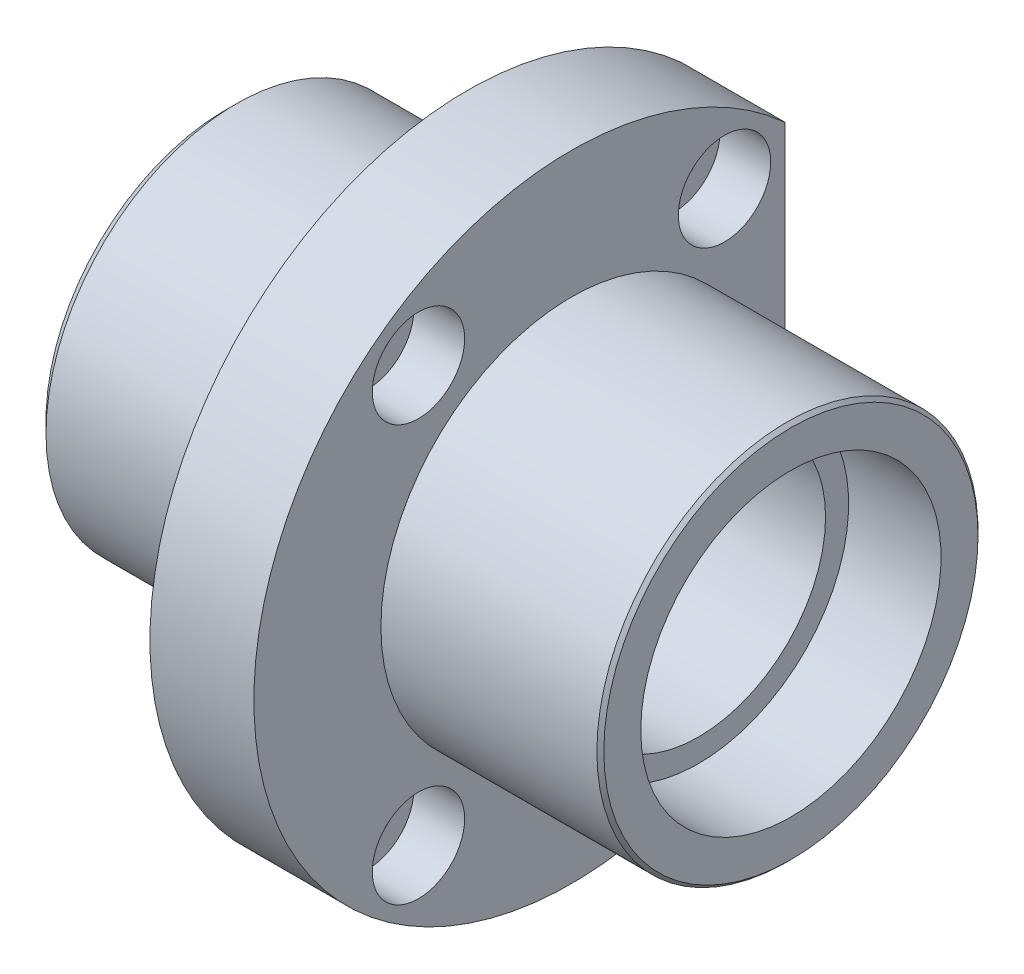
ISO-10303-21;
HEADER;
FILE_DESCRIPTION(('STEP AP214'),'2;1');
FILE_NAME('part.step','',(''),(''),'','','');
FILE_SCHEMA(('AUTOMOTIVE_DESIGN { 1 0 10303 214 1 1 1 1 }'));
ENDSEC;
DATA;
#1=APPLICATION_CONTEXT('core data for automotive mechanical design processes');
#2=APPLICATION_PROTOCOL_DEFINITION('international standard','automotive_design',2000,#1);
#3=PRODUCT_CONTEXT('',#1,'mechanical');
#4=PRODUCT('Part','Part','',(#3));
#5=PRODUCT_RELATED_PRODUCT_CATEGORY('part','',(#4));
#6=PRODUCT_DEFINITION_FORMATION('','',#4);
#7=PRODUCT_DEFINITION_CONTEXT('part definition',#1,'design');
#8=PRODUCT_DEFINITION('design','',#6,#7);
#9=PRODUCT_DEFINITION_SHAPE('','',#8);
#10=(LENGTH_UNIT() NAMED_UNIT(*) SI_UNIT(.MILLI.,.METRE.));
#11=(NAMED_UNIT(*) PLANE_ANGLE_UNIT() SI_UNIT($,.RADIAN.));
#12=(NAMED_UNIT(*) SI_UNIT($,.STERADIAN.) SOLID_ANGLE_UNIT());
#13=UNCERTAINTY_MEASURE_WITH_UNIT(LENGTH_MEASURE(1.E-05),#10,'distance_accuracy_value','');
#14=(GEOMETRIC_REPRESENTATION_CONTEXT(3) GLOBAL_UNCERTAINTY_ASSIGNED_CONTEXT((#13)) GLOBAL_UNIT_ASSIGNED_CONTEXT((#10,
#11,#12)) REPRESENTATION_CONTEXT('',''));
#15=CARTESIAN_POINT('',(0.,0.,0.));
#16=DIRECTION('',(0.,0.,1.));
#17=DIRECTION('',(1.,0.,0.));
#18=AXIS2_PLACEMENT_3D('',#15,#16,#17);
#19=CARTESIAN_POINT('',(-21.,0.,0.));
#20=DIRECTION('',(1.,0.,0.));
#21=DIRECTION('',(0.,0.,-1.));
#22=AXIS2_PLACEMENT_3D('',#19,#20,#21);
#23=PLANE('',#22);
#24=CARTESIAN_POINT('',(-21.,0.,0.));
#25=DIRECTION('',(1.,0.,0.));
#26=DIRECTION('',(0.,0.,-1.));
#27=AXIS2_PLACEMENT_3D('',#24,#25,#26);
#28=CIRCLE('',#27,15.5);
#29=CARTESIAN_POINT('',(-21.,0.,-15.5));
#30=VERTEX_POINT('',#29);
#31=EDGE_CURVE('E76',#30,#30,#28,.F.);
#32=ORIENTED_EDGE('',*,*,#31,.T.);
#33=EDGE_LOOP('',(#32));
#34=FACE_BOUND('',#33,.T.);
#35=CARTESIAN_POINT('',(-21.,0.,0.));
#36=DIRECTION('',(-1.,0.,0.));
#37=DIRECTION('',(0.,0.,1.));
#38=AXIS2_PLACEMENT_3D('',#35,#36,#37);
#39=CIRCLE('',#38,13.);
#40=CARTESIAN_POINT('',(-21.,0.,13.));
#41=VERTEX_POINT('',#40);
#42=EDGE_CURVE('E265',#41,#41,#39,.T.);
#43=ORIENTED_EDGE('',*,*,#42,.F.);
#44=EDGE_LOOP('',(#43));
#45=FACE_BOUND('',#44,.T.);
#46=ADVANCED_FACE('F32',(#34,#45),#23,.F.);
#47=CARTESIAN_POINT('',(28.,16.5,0.));
#48=DIRECTION('',(-1.,0.,0.));
#49=DIRECTION('',(0.,0.,1.));
#50=AXIS2_PLACEMENT_3D('',#47,#48,#49);
#51=PLANE('',#50);
#52=CARTESIAN_POINT('',(28.,0.,0.));
#53=DIRECTION('',(-1.,0.,0.));
#54=DIRECTION('',(0.,0.,1.));
#55=AXIS2_PLACEMENT_3D('',#52,#53,#54);
#56=CIRCLE('',#55,16.2);
#57=CARTESIAN_POINT('',(28.,0.,16.2));
#58=VERTEX_POINT('',#57);
#59=EDGE_CURVE('E11',#58,#58,#56,.F.);
#60=ORIENTED_EDGE('',*,*,#59,.T.);
#61=EDGE_LOOP('',(#60));
#62=FACE_BOUND('',#61,.T.);
#63=CARTESIAN_POINT('',(28.,0.,0.));
#64=DIRECTION('',(-1.,0.,0.));
#65=DIRECTION('',(0.,0.,1.));
#66=AXIS2_PLACEMENT_3D('',#63,#64,#65);
#67=CIRCLE('',#66,13.);
#68=CARTESIAN_POINT('',(28.,0.,13.));
#69=VERTEX_POINT('',#68);
#70=EDGE_CURVE('E62',#69,#69,#67,.T.);
#71=ORIENTED_EDGE('',*,*,#70,.T.);
#72=EDGE_LOOP('',(#71));
#73=FACE_BOUND('',#72,.T.);
#74=ADVANCED_FACE('F121',(#62,#73),#51,.F.);
#75=CARTESIAN_POINT('',(-30.2027653872065,0.,0.));
#76=DIRECTION('',(-1.,0.,0.));
#77=DIRECTION('',(0.,0.,1.));
#78=AXIS2_PLACEMENT_3D('',#75,#76,#77);
#79=CYLINDRICAL_SURFACE('',#78,16.5);
#80=CARTESIAN_POINT('',(-20.,0.,0.));
#81=DIRECTION('',(1.,0.,0.));
#82=DIRECTION('',(0.,0.,-1.));
#83=AXIS2_PLACEMENT_3D('',#80,#81,#82);
#84=CIRCLE('',#83,16.5);
#85=CARTESIAN_POINT('',(-20.,0.,-16.5));
#86=VERTEX_POINT('',#85);
#87=EDGE_CURVE('E103',#86,#86,#84,.T.);
#88=ORIENTED_EDGE('',*,*,#87,.T.);
#89=EDGE_LOOP('',(#88));
#90=FACE_BOUND('',#89,.T.);
#91=CARTESIAN_POINT('',(0.,0.,0.));
#92=DIRECTION('',(-1.,0.,0.));
#93=DIRECTION('',(0.,0.,1.));
#94=AXIS2_PLACEMENT_3D('',#91,#92,#93);
#95=CIRCLE('',#94,16.5);
#96=CARTESIAN_POINT('',(0.,0.,16.5));
#97=VERTEX_POINT('',#96);
#98=EDGE_CURVE('E73',#97,#97,#95,.T.);
#99=ORIENTED_EDGE('',*,*,#98,.T.);
#100=EDGE_LOOP('',(#99));
#101=FACE_BOUND('',#100,.T.);
#102=ADVANCED_FACE('F127',(#90,#101),#79,.T.);
#103=CARTESIAN_POINT('',(0.,16.5,0.));
#104=DIRECTION('',(1.,0.,0.));
#105=DIRECTION('',(0.,0.,-1.));
#106=AXIS2_PLACEMENT_3D('',#103,#104,#105);
#107=PLANE('',#106);
#108=CARTESIAN_POINT('',(0.,18.,13.25));
#109=DIRECTION('',(1.,0.,0.));
#110=DIRECTION('',(0.,0.,-1.));
#111=AXIS2_PLACEMENT_3D('',#108,#109,#110);
#112=CIRCLE('',#111,2.25);
#113=CARTESIAN_POINT('',(0.,18.,11.));
#114=VERTEX_POINT('',#113);
#115=EDGE_CURVE('E96',#114,#114,#112,.T.);
#116=ORIENTED_EDGE('',*,*,#115,.T.);
#117=EDGE_LOOP('',(#116));
#118=FACE_BOUND('',#117,.T.);
#119=CARTESIAN_POINT('',(0.,18.,-13.25));
#120=DIRECTION('',(1.,0.,0.));
#121=DIRECTION('',(0.,0.,-1.));
#122=AXIS2_PLACEMENT_3D('',#119,#120,#121);
#123=CIRCLE('',#122,2.25);
#124=CARTESIAN_POINT('',(0.,18.,-15.5));
#125=VERTEX_POINT('',#124);
#126=EDGE_CURVE('E91',#125,#125,#123,.T.);
#127=ORIENTED_EDGE('',*,*,#126,.T.);
#128=EDGE_LOOP('',(#127));
#129=FACE_BOUND('',#128,.T.);
#130=CARTESIAN_POINT('',(0.,-18.,-13.25));
#131=DIRECTION('',(1.,0.,0.));
#132=DIRECTION('',(0.,0.,-1.));
#133=AXIS2_PLACEMENT_3D('',#130,#131,#132);
#134=CIRCLE('',#133,2.25);
#135=CARTESIAN_POINT('',(0.,-18.,-15.5));
#136=VERTEX_POINT('',#135);
#137=EDGE_CURVE('E86',#136,#136,#134,.T.);
#138=ORIENTED_EDGE('',*,*,#137,.T.);
#139=EDGE_LOOP('',(#138));
#140=FACE_BOUND('',#139,.T.);
#141=CARTESIAN_POINT('',(0.,-18.,13.25));
#142=DIRECTION('',(1.,0.,0.));
#143=DIRECTION('',(0.,0.,-1.));
#144=AXIS2_PLACEMENT_3D('',#141,#142,#143);
#145=CIRCLE('',#144,2.25);
#146=CARTESIAN_POINT('',(0.,-18.,11.));
#147=VERTEX_POINT('',#146);
#148=EDGE_CURVE('E82',#147,#147,#145,.T.);
#149=ORIENTED_EDGE('',*,*,#148,.T.);
#150=EDGE_LOOP('',(#149));
#151=FACE_BOUND('',#150,.T.);
#152=ORIENTED_EDGE('',*,*,#98,.F.);
#153=EDGE_LOOP('',(#152));
#154=FACE_BOUND('',#153,.T.);
#155=CARTESIAN_POINT('',(0.,0.,0.));
#156=DIRECTION('',(-1.,0.,0.));
#157=DIRECTION('',(0.,0.,1.));
#158=AXIS2_PLACEMENT_3D('',#155,#156,#157);
#159=CIRCLE('',#158,27.5);
#160=CARTESIAN_POINT('',(0.,-20.3469899493758,-18.5));
#161=VERTEX_POINT('',#160);
#162=CARTESIAN_POINT('',(0.,20.3469899493758,-18.5));
#163=VERTEX_POINT('',#162);
#164=EDGE_CURVE('E67',#161,#163,#159,.T.);
#165=ORIENTED_EDGE('',*,*,#164,.T.);
#166=DIRECTION('',(0.,1.,0.));
#167=VECTOR('',#166,1.);
#168=CARTESIAN_POINT('',(0.,20.3469899493758,-18.5));
#169=LINE('',#168,#167);
#170=EDGE_CURVE('E57',#161,#163,#169,.T.);
#171=ORIENTED_EDGE('',*,*,#170,.F.);
#172=EDGE_LOOP('',(#165,#171));
#173=FACE_BOUND('',#172,.T.);
#174=ADVANCED_FACE('F72',(#118,#129,#140,#151,#154,#173),#107,.F.);
#175=CARTESIAN_POINT('',(-30.2027653872065,0.,0.));
#176=DIRECTION('',(-1.,0.,0.));
#177=DIRECTION('',(0.,0.,1.));
#178=AXIS2_PLACEMENT_3D('',#175,#176,#177);
#179=CYLINDRICAL_SURFACE('',#178,27.5);
#180=CARTESIAN_POINT('',(9.,0.,0.));
#181=DIRECTION('',(-1.,0.,0.));
#182=DIRECTION('',(0.,0.,1.));
#183=AXIS2_PLACEMENT_3D('',#180,#181,#182);
#184=CIRCLE('',#183,27.5);
#185=CARTESIAN_POINT('',(9.,-20.3469899493758,-18.5));
#186=VERTEX_POINT('',#185);
#187=CARTESIAN_POINT('',(9.,20.3469899493758,-18.5));
#188=VERTEX_POINT('',#187);
#189=EDGE_CURVE('E69',#186,#188,#184,.T.);
#190=ORIENTED_EDGE('',*,*,#189,.T.);
#191=DIRECTION('',(1.,0.,0.));
#192=VECTOR('',#191,1.);
#193=CARTESIAN_POINT('',(-21.001,20.3469899493758,-18.5));
#194=LINE('',#193,#192);
#195=EDGE_CURVE('E47',#163,#188,#194,.T.);
#196=ORIENTED_EDGE('',*,*,#195,.F.);
#197=ORIENTED_EDGE('',*,*,#164,.F.);
#198=DIRECTION('',(1.,0.,0.));
#199=VECTOR('',#198,1.);
#200=CARTESIAN_POINT('',(-21.001,-20.3469899493758,-18.5));
#201=LINE('',#200,#199);
#202=EDGE_CURVE('E52',#161,#186,#201,.T.);
#203=ORIENTED_EDGE('',*,*,#202,.T.);
#204=EDGE_LOOP('',(#190,#196,#197,#203));
#205=FACE_BOUND('',#204,.T.);
#206=ADVANCED_FACE('F66',(#205),#179,.T.);
#207=CARTESIAN_POINT('',(9.,27.5,0.));
#208=DIRECTION('',(-1.,0.,0.));
#209=DIRECTION('',(0.,0.,1.));
#210=AXIS2_PLACEMENT_3D('',#207,#208,#209);
#211=PLANE('',#210);
#212=CARTESIAN_POINT('',(9.,18.,13.25));
#213=DIRECTION('',(1.,0.,0.));
#214=DIRECTION('',(0.,0.,-1.));
#215=AXIS2_PLACEMENT_3D('',#212,#213,#214);
#216=CIRCLE('',#215,4.);
#217=CARTESIAN_POINT('',(9.,18.,9.25));
#218=VERTEX_POINT('',#217);
#219=EDGE_CURVE('E222',#218,#218,#216,.T.);
#220=ORIENTED_EDGE('',*,*,#219,.F.);
#221=EDGE_LOOP('',(#220));
#222=FACE_BOUND('',#221,.T.);
#223=CARTESIAN_POINT('',(9.,18.,-13.25));
#224=DIRECTION('',(1.,0.,0.));
#225=DIRECTION('',(0.,0.,-1.));
#226=AXIS2_PLACEMENT_3D('',#223,#224,#225);
#227=CIRCLE('',#226,4.);
#228=CARTESIAN_POINT('',(9.,18.,-17.25));
#229=VERTEX_POINT('',#228);
#230=EDGE_CURVE('E99',#229,#229,#227,.T.);
#231=ORIENTED_EDGE('',*,*,#230,.F.);
#232=EDGE_LOOP('',(#231));
#233=FACE_BOUND('',#232,.T.);
#234=CARTESIAN_POINT('',(9.,-18.,-13.25));
#235=DIRECTION('',(1.,0.,0.));
#236=DIRECTION('',(0.,0.,-1.));
#237=AXIS2_PLACEMENT_3D('',#234,#235,#236);
#238=CIRCLE('',#237,4.);
#239=CARTESIAN_POINT('',(9.,-18.,-17.25));
#240=VERTEX_POINT('',#239);
#241=EDGE_CURVE('E94',#240,#240,#238,.T.);
#242=ORIENTED_EDGE('',*,*,#241,.F.);
#243=EDGE_LOOP('',(#242));
#244=FACE_BOUND('',#243,.T.);
#245=CARTESIAN_POINT('',(9.,-18.,13.25));
#246=DIRECTION('',(1.,0.,0.));
#247=DIRECTION('',(0.,0.,-1.));
#248=AXIS2_PLACEMENT_3D('',#245,#246,#247);
#249=CIRCLE('',#248,4.);
#250=CARTESIAN_POINT('',(9.,-18.,9.25));
#251=VERTEX_POINT('',#250);
#252=EDGE_CURVE('E89',#251,#251,#249,.T.);
#253=ORIENTED_EDGE('',*,*,#252,.F.);
#254=EDGE_LOOP('',(#253));
#255=FACE_BOUND('',#254,.T.);
#256=ORIENTED_EDGE('',*,*,#189,.F.);
#257=DIRECTION('',(0.,-1.,0.));
#258=VECTOR('',#257,1.);
#259=CARTESIAN_POINT('',(9.,20.3469899493758,-18.5));
#260=LINE('',#259,#258);
#261=EDGE_CURVE('E70',#188,#186,#260,.T.);
#262=ORIENTED_EDGE('',*,*,#261,.F.);
#263=EDGE_LOOP('',(#256,#262));
#264=FACE_BOUND('',#263,.T.);
#265=CARTESIAN_POINT('',(9.,0.,0.));
#266=DIRECTION('',(-1.,0.,0.));
#267=DIRECTION('',(0.,0.,1.));
#268=AXIS2_PLACEMENT_3D('',#265,#266,#267);
#269=CIRCLE('',#268,16.5);
#270=CARTESIAN_POINT('',(9.,0.,16.5));
#271=VERTEX_POINT('',#270);
#272=EDGE_CURVE('E78',#271,#271,#269,.T.);
#273=ORIENTED_EDGE('',*,*,#272,.T.);
#274=EDGE_LOOP('',(#273));
#275=FACE_BOUND('',#274,.T.);
#276=ADVANCED_FACE('F140',(#222,#233,#244,#255,#264,#275),#211,.F.);
#277=CARTESIAN_POINT('',(-30.2027653872065,0.,0.));
#278=DIRECTION('',(-1.,0.,0.));
#279=DIRECTION('',(0.,0.,1.));
#280=AXIS2_PLACEMENT_3D('',#277,#278,#279);
#281=CYLINDRICAL_SURFACE('',#280,16.5);
#282=CARTESIAN_POINT('',(27.7,0.,0.));
#283=DIRECTION('',(-1.,0.,0.));
#284=DIRECTION('',(0.,0.,1.));
#285=AXIS2_PLACEMENT_3D('',#282,#283,#284);
#286=CIRCLE('',#285,16.5);
#287=CARTESIAN_POINT('',(27.7,0.,16.5));
#288=VERTEX_POINT('',#287);
#289=EDGE_CURVE('E40',#288,#288,#286,.T.);
#290=ORIENTED_EDGE('',*,*,#289,.T.);
#291=EDGE_LOOP('',(#290));
#292=FACE_BOUND('',#291,.T.);
#293=ORIENTED_EDGE('',*,*,#272,.F.);
#294=EDGE_LOOP('',(#293));
#295=FACE_BOUND('',#294,.T.);
#296=ADVANCED_FACE('F108',(#292,#295),#281,.T.);
#297=CARTESIAN_POINT('',(-25.4914036173578,0.,0.));
#298=DIRECTION('',(-1.,0.,0.));
#299=DIRECTION('',(0.,0.,1.));
#300=AXIS2_PLACEMENT_3D('',#297,#298,#299);
#301=CYLINDRICAL_SURFACE('',#300,13.);
#302=ORIENTED_EDGE('',*,*,#42,.T.);
#303=EDGE_LOOP('',(#302));
#304=FACE_BOUND('',#303,.T.);
#305=CARTESIAN_POINT('',(-5.,0.,0.));
#306=DIRECTION('',(-1.,0.,0.));
#307=DIRECTION('',(0.,0.,1.));
#308=AXIS2_PLACEMENT_3D('',#305,#306,#307);
#309=CIRCLE('',#308,13.);
#310=CARTESIAN_POINT('',(-5.,0.,13.));
#311=VERTEX_POINT('',#310);
#312=EDGE_CURVE('E262',#311,#311,#309,.T.);
#313=ORIENTED_EDGE('',*,*,#312,.F.);
#314=EDGE_LOOP('',(#313));
#315=FACE_BOUND('',#314,.T.);
#316=ADVANCED_FACE('F145',(#304,#315),#301,.F.);
#317=CARTESIAN_POINT('',(-5.,13.,0.));
#318=DIRECTION('',(-1.,0.,0.));
#319=DIRECTION('',(0.,0.,1.));
#320=AXIS2_PLACEMENT_3D('',#317,#318,#319);
#321=PLANE('',#320);
#322=ORIENTED_EDGE('',*,*,#312,.T.);
#323=EDGE_LOOP('',(#322));
#324=FACE_BOUND('',#323,.T.);
#325=CARTESIAN_POINT('',(-5.,0.,0.));
#326=DIRECTION('',(-1.,0.,0.));
#327=DIRECTION('',(0.,0.,1.));
#328=AXIS2_PLACEMENT_3D('',#325,#326,#327);
#329=CIRCLE('',#328,11.);
#330=CARTESIAN_POINT('',(-5.,0.,11.));
#331=VERTEX_POINT('',#330);
#332=EDGE_CURVE('E259',#331,#331,#329,.T.);
#333=ORIENTED_EDGE('',*,*,#332,.F.);
#334=EDGE_LOOP('',(#333));
#335=FACE_BOUND('',#334,.T.);
#336=ADVANCED_FACE('F149',(#324,#335),#321,.T.);
#337=CARTESIAN_POINT('',(-25.4914036173578,0.,0.));
#338=DIRECTION('',(-1.,0.,0.));
#339=DIRECTION('',(0.,0.,1.));
#340=AXIS2_PLACEMENT_3D('',#337,#338,#339);
#341=CYLINDRICAL_SURFACE('',#340,11.);
#342=ORIENTED_EDGE('',*,*,#332,.T.);
#343=EDGE_LOOP('',(#342));
#344=FACE_BOUND('',#343,.T.);
#345=CARTESIAN_POINT('',(20.,0.,0.));
#346=DIRECTION('',(-1.,0.,0.));
#347=DIRECTION('',(0.,0.,1.));
#348=AXIS2_PLACEMENT_3D('',#345,#346,#347);
#349=CIRCLE('',#348,11.);
#350=CARTESIAN_POINT('',(20.,0.,11.));
#351=VERTEX_POINT('',#350);
#352=EDGE_CURVE('E256',#351,#351,#349,.T.);
#353=ORIENTED_EDGE('',*,*,#352,.F.);
#354=EDGE_LOOP('',(#353));
#355=FACE_BOUND('',#354,.T.);
#356=ADVANCED_FACE('F153',(#344,#355),#341,.F.);
#357=CARTESIAN_POINT('',(20.,11.,0.));
#358=DIRECTION('',(1.,0.,0.));
#359=DIRECTION('',(0.,0.,-1.));
#360=AXIS2_PLACEMENT_3D('',#357,#358,#359);
#361=PLANE('',#360);
#362=ORIENTED_EDGE('',*,*,#352,.T.);
#363=EDGE_LOOP('',(#362));
#364=FACE_BOUND('',#363,.T.);
#365=CARTESIAN_POINT('',(20.,0.,0.));
#366=DIRECTION('',(-1.,0.,0.));
#367=DIRECTION('',(0.,0.,1.));
#368=AXIS2_PLACEMENT_3D('',#365,#366,#367);
#369=CIRCLE('',#368,13.);
#370=CARTESIAN_POINT('',(20.,0.,13.));
#371=VERTEX_POINT('',#370);
#372=EDGE_CURVE('E253',#371,#371,#369,.T.);
#373=ORIENTED_EDGE('',*,*,#372,.F.);
#374=EDGE_LOOP('',(#373));
#375=FACE_BOUND('',#374,.T.);
#376=ADVANCED_FACE('F157',(#364,#375),#361,.T.);
#377=CARTESIAN_POINT('',(-25.4914036173578,0.,0.));
#378=DIRECTION('',(-1.,0.,0.));
#379=DIRECTION('',(0.,0.,1.));
#380=AXIS2_PLACEMENT_3D('',#377,#378,#379);
#381=CYLINDRICAL_SURFACE('',#380,13.);
#382=ORIENTED_EDGE('',*,*,#372,.T.);
#383=EDGE_LOOP('',(#382));
#384=FACE_BOUND('',#383,.T.);
#385=ORIENTED_EDGE('',*,*,#70,.F.);
#386=EDGE_LOOP('',(#385));
#387=FACE_BOUND('',#386,.T.);
#388=ADVANCED_FACE('F161',(#384,#387),#381,.F.);
#389=CARTESIAN_POINT('',(-21.001,20.3469899493758,-18.5));
#390=DIRECTION('',(0.,0.,1.));
#391=DIRECTION('',(1.,0.,0.));
#392=AXIS2_PLACEMENT_3D('',#389,#390,#391);
#393=PLANE('',#392);
#394=ORIENTED_EDGE('',*,*,#170,.T.);
#395=ORIENTED_EDGE('',*,*,#195,.T.);
#396=ORIENTED_EDGE('',*,*,#261,.T.);
#397=ORIENTED_EDGE('',*,*,#202,.F.);
#398=EDGE_LOOP('',(#394,#395,#396,#397));
#399=FACE_BOUND('',#398,.T.);
#400=ADVANCED_FACE('F58',(#399),#393,.F.);
#401=CARTESIAN_POINT('',(9.,-18.,13.25));
#402=DIRECTION('',(1.,0.,0.));
#403=DIRECTION('',(0.,0.,-1.));
#404=AXIS2_PLACEMENT_3D('',#401,#402,#403);
#405=CYLINDRICAL_SURFACE('',#404,2.25);
#406=CARTESIAN_POINT('',(4.6,-18.,13.25));
#407=DIRECTION('',(1.,0.,0.));
#408=DIRECTION('',(0.,0.,-1.));
#409=AXIS2_PLACEMENT_3D('',#406,#407,#408);
#410=CIRCLE('',#409,2.25);
#411=CARTESIAN_POINT('',(4.6,-18.,11.));
#412=VERTEX_POINT('',#411);
#413=EDGE_CURVE('E85',#412,#412,#410,.T.);
#414=ORIENTED_EDGE('',*,*,#413,.T.);
#415=EDGE_LOOP('',(#414));
#416=FACE_BOUND('',#415,.T.);
#417=ORIENTED_EDGE('',*,*,#148,.F.);
#418=EDGE_LOOP('',(#417));
#419=FACE_BOUND('',#418,.T.);
#420=ADVANCED_FACE('F168',(#416,#419),#405,.F.);
#421=CARTESIAN_POINT('',(4.6,-15.75,13.25));
#422=DIRECTION('',(-1.,0.,0.));
#423=DIRECTION('',(0.,0.,1.));
#424=AXIS2_PLACEMENT_3D('',#421,#422,#423);
#425=PLANE('',#424);
#426=ORIENTED_EDGE('',*,*,#413,.F.);
#427=EDGE_LOOP('',(#426));
#428=FACE_BOUND('',#427,.T.);
#429=CARTESIAN_POINT('',(4.6,-18.,13.25));
#430=DIRECTION('',(1.,0.,0.));
#431=DIRECTION('',(0.,0.,-1.));
#432=AXIS2_PLACEMENT_3D('',#429,#430,#431);
#433=CIRCLE('',#432,4.);
#434=CARTESIAN_POINT('',(4.6,-18.,9.25));
#435=VERTEX_POINT('',#434);
#436=EDGE_CURVE('E244',#435,#435,#433,.T.);
#437=ORIENTED_EDGE('',*,*,#436,.T.);
#438=EDGE_LOOP('',(#437));
#439=FACE_BOUND('',#438,.T.);
#440=ADVANCED_FACE('F171',(#428,#439),#425,.F.);
#441=CARTESIAN_POINT('',(9.,-18.,13.25));
#442=DIRECTION('',(1.,0.,0.));
#443=DIRECTION('',(0.,0.,-1.));
#444=AXIS2_PLACEMENT_3D('',#441,#442,#443);
#445=CYLINDRICAL_SURFACE('',#444,4.);
#446=ORIENTED_EDGE('',*,*,#436,.F.);
#447=EDGE_LOOP('',(#446));
#448=FACE_BOUND('',#447,.T.);
#449=ORIENTED_EDGE('',*,*,#252,.T.);
#450=EDGE_LOOP('',(#449));
#451=FACE_BOUND('',#450,.T.);
#452=ADVANCED_FACE('F175',(#448,#451),#445,.F.);
#453=CARTESIAN_POINT('',(9.,-18.,-13.25));
#454=DIRECTION('',(1.,0.,0.));
#455=DIRECTION('',(0.,0.,-1.));
#456=AXIS2_PLACEMENT_3D('',#453,#454,#455);
#457=CYLINDRICAL_SURFACE('',#456,2.25);
#458=CARTESIAN_POINT('',(4.6,-18.,-13.25));
#459=DIRECTION('',(1.,0.,0.));
#460=DIRECTION('',(0.,0.,-1.));
#461=AXIS2_PLACEMENT_3D('',#458,#459,#460);
#462=CIRCLE('',#461,2.25);
#463=CARTESIAN_POINT('',(4.6,-18.,-15.5));
#464=VERTEX_POINT('',#463);
#465=EDGE_CURVE('E90',#464,#464,#462,.T.);
#466=ORIENTED_EDGE('',*,*,#465,.T.);
#467=EDGE_LOOP('',(#466));
#468=FACE_BOUND('',#467,.T.);
#469=ORIENTED_EDGE('',*,*,#137,.F.);
#470=EDGE_LOOP('',(#469));
#471=FACE_BOUND('',#470,.T.);
#472=ADVANCED_FACE('F179',(#468,#471),#457,.F.);
#473=CARTESIAN_POINT('',(4.6,-15.75,-13.25));
#474=DIRECTION('',(-1.,0.,0.));
#475=DIRECTION('',(0.,0.,1.));
#476=AXIS2_PLACEMENT_3D('',#473,#474,#475);
#477=PLANE('',#476);
#478=ORIENTED_EDGE('',*,*,#465,.F.);
#479=EDGE_LOOP('',(#478));
#480=FACE_BOUND('',#479,.T.);
#481=CARTESIAN_POINT('',(4.6,-18.,-13.25));
#482=DIRECTION('',(1.,0.,0.));
#483=DIRECTION('',(0.,0.,-1.));
#484=AXIS2_PLACEMENT_3D('',#481,#482,#483);
#485=CIRCLE('',#484,4.);
#486=CARTESIAN_POINT('',(4.6,-18.,-17.25));
#487=VERTEX_POINT('',#486);
#488=EDGE_CURVE('E237',#487,#487,#485,.T.);
#489=ORIENTED_EDGE('',*,*,#488,.T.);
#490=EDGE_LOOP('',(#489));
#491=FACE_BOUND('',#490,.T.);
#492=ADVANCED_FACE('F183',(#480,#491),#477,.F.);
#493=CARTESIAN_POINT('',(9.,-18.,-13.25));
#494=DIRECTION('',(1.,0.,0.));
#495=DIRECTION('',(0.,0.,-1.));
#496=AXIS2_PLACEMENT_3D('',#493,#494,#495);
#497=CYLINDRICAL_SURFACE('',#496,4.);
#498=ORIENTED_EDGE('',*,*,#488,.F.);
#499=EDGE_LOOP('',(#498));
#500=FACE_BOUND('',#499,.T.);
#501=ORIENTED_EDGE('',*,*,#241,.T.);
#502=EDGE_LOOP('',(#501));
#503=FACE_BOUND('',#502,.T.);
#504=ADVANCED_FACE('F187',(#500,#503),#497,.F.);
#505=CARTESIAN_POINT('',(9.,18.,-13.25));
#506=DIRECTION('',(1.,0.,0.));
#507=DIRECTION('',(0.,0.,-1.));
#508=AXIS2_PLACEMENT_3D('',#505,#506,#507);
#509=CYLINDRICAL_SURFACE('',#508,2.25);
#510=CARTESIAN_POINT('',(4.6,18.,-13.25));
#511=DIRECTION('',(1.,0.,0.));
#512=DIRECTION('',(0.,0.,-1.));
#513=AXIS2_PLACEMENT_3D('',#510,#511,#512);
#514=CIRCLE('',#513,2.25);
#515=CARTESIAN_POINT('',(4.6,18.,-15.5));
#516=VERTEX_POINT('',#515);
#517=EDGE_CURVE('E95',#516,#516,#514,.T.);
#518=ORIENTED_EDGE('',*,*,#517,.T.);
#519=EDGE_LOOP('',(#518));
#520=FACE_BOUND('',#519,.T.);
#521=ORIENTED_EDGE('',*,*,#126,.F.);
#522=EDGE_LOOP('',(#521));
#523=FACE_BOUND('',#522,.T.);
#524=ADVANCED_FACE('F191',(#520,#523),#509,.F.);
#525=CARTESIAN_POINT('',(4.6,20.25,-13.25));
#526=DIRECTION('',(-1.,0.,0.));
#527=DIRECTION('',(0.,0.,1.));
#528=AXIS2_PLACEMENT_3D('',#525,#526,#527);
#529=PLANE('',#528);
#530=ORIENTED_EDGE('',*,*,#517,.F.);
#531=EDGE_LOOP('',(#530));
#532=FACE_BOUND('',#531,.T.);
#533=CARTESIAN_POINT('',(4.6,18.,-13.25));
#534=DIRECTION('',(1.,0.,0.));
#535=DIRECTION('',(0.,0.,-1.));
#536=AXIS2_PLACEMENT_3D('',#533,#534,#535);
#537=CIRCLE('',#536,4.);
#538=CARTESIAN_POINT('',(4.6,18.,-17.25));
#539=VERTEX_POINT('',#538);
#540=EDGE_CURVE('E230',#539,#539,#537,.T.);
#541=ORIENTED_EDGE('',*,*,#540,.T.);
#542=EDGE_LOOP('',(#541));
#543=FACE_BOUND('',#542,.T.);
#544=ADVANCED_FACE('F195',(#532,#543),#529,.F.);
#545=CARTESIAN_POINT('',(9.,18.,-13.25));
#546=DIRECTION('',(1.,0.,0.));
#547=DIRECTION('',(0.,0.,-1.));
#548=AXIS2_PLACEMENT_3D('',#545,#546,#547);
#549=CYLINDRICAL_SURFACE('',#548,4.);
#550=ORIENTED_EDGE('',*,*,#540,.F.);
#551=EDGE_LOOP('',(#550));
#552=FACE_BOUND('',#551,.T.);
#553=ORIENTED_EDGE('',*,*,#230,.T.);
#554=EDGE_LOOP('',(#553));
#555=FACE_BOUND('',#554,.T.);
#556=ADVANCED_FACE('F199',(#552,#555),#549,.F.);
#557=CARTESIAN_POINT('',(9.,18.,13.25));
#558=DIRECTION('',(1.,0.,0.));
#559=DIRECTION('',(0.,0.,-1.));
#560=AXIS2_PLACEMENT_3D('',#557,#558,#559);
#561=CYLINDRICAL_SURFACE('',#560,2.25);
#562=CARTESIAN_POINT('',(4.6,18.,13.25));
#563=DIRECTION('',(1.,0.,0.));
#564=DIRECTION('',(0.,0.,-1.));
#565=AXIS2_PLACEMENT_3D('',#562,#563,#564);
#566=CIRCLE('',#565,2.25);
#567=CARTESIAN_POINT('',(4.6,18.,11.));
#568=VERTEX_POINT('',#567);
#569=EDGE_CURVE('E100',#568,#568,#566,.T.);
#570=ORIENTED_EDGE('',*,*,#569,.T.);
#571=EDGE_LOOP('',(#570));
#572=FACE_BOUND('',#571,.T.);
#573=ORIENTED_EDGE('',*,*,#115,.F.);
#574=EDGE_LOOP('',(#573));
#575=FACE_BOUND('',#574,.T.);
#576=ADVANCED_FACE('F203',(#572,#575),#561,.F.);
#577=CARTESIAN_POINT('',(4.6,20.25,13.25));
#578=DIRECTION('',(-1.,0.,0.));
#579=DIRECTION('',(0.,0.,1.));
#580=AXIS2_PLACEMENT_3D('',#577,#578,#579);
#581=PLANE('',#580);
#582=ORIENTED_EDGE('',*,*,#569,.F.);
#583=EDGE_LOOP('',(#582));
#584=FACE_BOUND('',#583,.T.);
#585=CARTESIAN_POINT('',(4.6,18.,13.25));
#586=DIRECTION('',(1.,0.,0.));
#587=DIRECTION('',(0.,0.,-1.));
#588=AXIS2_PLACEMENT_3D('',#585,#586,#587);
#589=CIRCLE('',#588,4.);
#590=CARTESIAN_POINT('',(4.6,18.,9.25));
#591=VERTEX_POINT('',#590);
#592=EDGE_CURVE('E219',#591,#591,#589,.T.);
#593=ORIENTED_EDGE('',*,*,#592,.T.);
#594=EDGE_LOOP('',(#593));
#595=FACE_BOUND('',#594,.T.);
#596=ADVANCED_FACE('F207',(#584,#595),#581,.F.);
#597=CARTESIAN_POINT('',(9.,18.,13.25));
#598=DIRECTION('',(1.,0.,0.));
#599=DIRECTION('',(0.,0.,-1.));
#600=AXIS2_PLACEMENT_3D('',#597,#598,#599);
#601=CYLINDRICAL_SURFACE('',#600,4.);
#602=ORIENTED_EDGE('',*,*,#592,.F.);
#603=EDGE_LOOP('',(#602));
#604=FACE_BOUND('',#603,.T.);
#605=ORIENTED_EDGE('',*,*,#219,.T.);
#606=EDGE_LOOP('',(#605));
#607=FACE_BOUND('',#606,.T.);
#608=ADVANCED_FACE('F117',(#604,#607),#601,.F.);
#609=CARTESIAN_POINT('',(-21.,0.,0.));
#610=DIRECTION('',(1.,0.,0.));
#611=DIRECTION('',(0.,0.,-1.));
#612=AXIS2_PLACEMENT_3D('',#609,#610,#611);
#613=CONICAL_SURFACE('',#612,15.5,0.785398163397452);
#614=ORIENTED_EDGE('',*,*,#87,.F.);
#615=EDGE_LOOP('',(#614));
#616=FACE_BOUND('',#615,.T.);
#617=ORIENTED_EDGE('',*,*,#31,.F.);
#618=EDGE_LOOP('',(#617));
#619=FACE_BOUND('',#618,.T.);
#620=ADVANCED_FACE('F112',(#616,#619),#613,.T.);
#621=CARTESIAN_POINT('',(27.7,0.,0.));
#622=DIRECTION('',(-1.,0.,0.));
#623=DIRECTION('',(0.,0.,1.));
#624=AXIS2_PLACEMENT_3D('',#621,#622,#623);
#625=CONICAL_SURFACE('',#624,16.5,0.785398163397448);
#626=ORIENTED_EDGE('',*,*,#59,.F.);
#627=EDGE_LOOP('',(#626));
#628=FACE_BOUND('',#627,.T.);
#629=ORIENTED_EDGE('',*,*,#289,.F.);
#630=EDGE_LOOP('',(#629));
#631=FACE_BOUND('',#630,.T.);
#632=ADVANCED_FACE('F34',(#628,#631),#625,.T.);
#633=CLOSED_SHELL('',(#46,#74,#102,#174,#206,#276,#296,#316,#336,#356,#376,#388,#400,#420,#440,
#452,#472,#492,#504,#524,#544,#556,#576,#596,#608,#620,#632));
#634=MANIFOLD_SOLID_BREP('B2',#633);
#635=ADVANCED_BREP_SHAPE_REPRESENTATION('',(#18,#634),#14);
#636=SHAPE_DEFINITION_REPRESENTATION(#9,#635);
ENDSEC;
END-ISO-10303-21;
